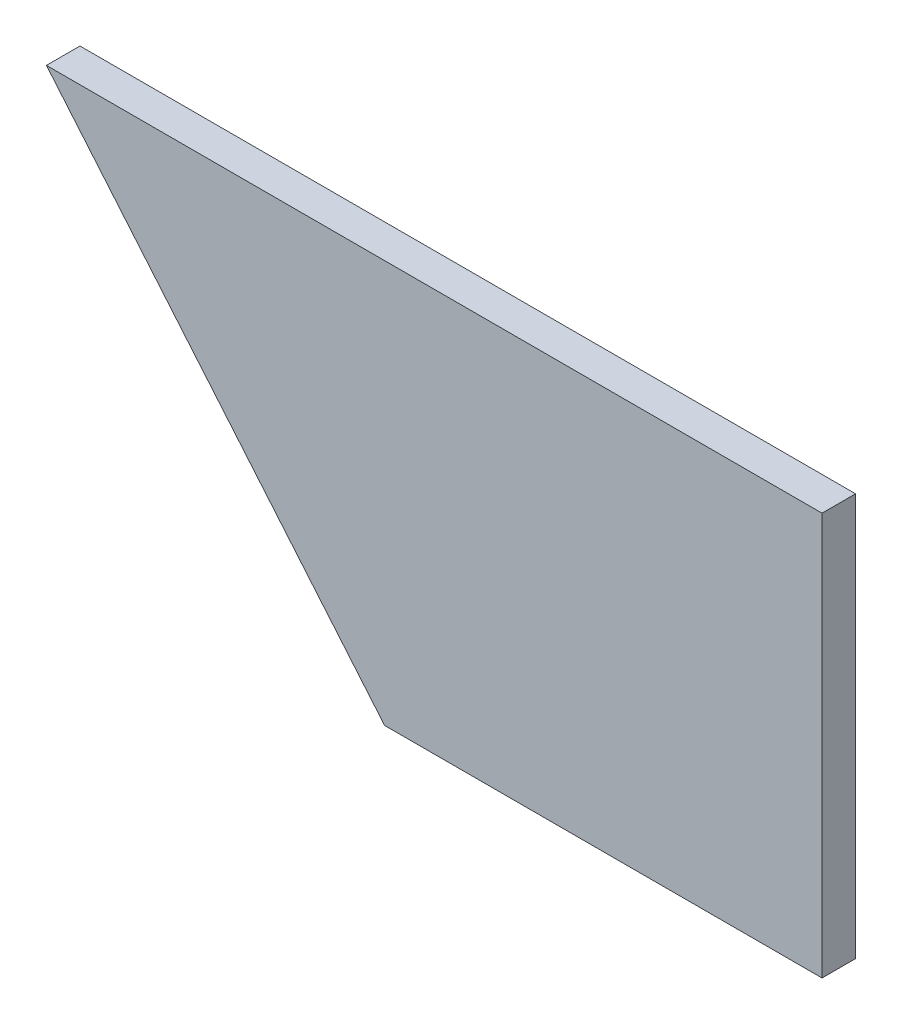
ISO-10303-21;
HEADER;
FILE_DESCRIPTION(('STEP AP214'),'2;1');
FILE_NAME('part.step','',(''),(''),'','','');
FILE_SCHEMA(('AUTOMOTIVE_DESIGN { 1 0 10303 214 1 1 1 1 }'));
ENDSEC;
DATA;
#1=APPLICATION_CONTEXT('core data for automotive mechanical design processes');
#2=APPLICATION_PROTOCOL_DEFINITION('international standard','automotive_design',2000,#1);
#3=PRODUCT_CONTEXT('',#1,'mechanical');
#4=PRODUCT('Part','Part','',(#3));
#5=PRODUCT_RELATED_PRODUCT_CATEGORY('part','',(#4));
#6=PRODUCT_DEFINITION_FORMATION('','',#4);
#7=PRODUCT_DEFINITION_CONTEXT('part definition',#1,'design');
#8=PRODUCT_DEFINITION('design','',#6,#7);
#9=PRODUCT_DEFINITION_SHAPE('','',#8);
#10=(LENGTH_UNIT() NAMED_UNIT(*) SI_UNIT(.MILLI.,.METRE.));
#11=(NAMED_UNIT(*) PLANE_ANGLE_UNIT() SI_UNIT($,.RADIAN.));
#12=(NAMED_UNIT(*) SI_UNIT($,.STERADIAN.) SOLID_ANGLE_UNIT());
#13=UNCERTAINTY_MEASURE_WITH_UNIT(LENGTH_MEASURE(1.E-05),#10,'distance_accuracy_value','');
#14=(GEOMETRIC_REPRESENTATION_CONTEXT(3) GLOBAL_UNCERTAINTY_ASSIGNED_CONTEXT((#13)) GLOBAL_UNIT_ASSIGNED_CONTEXT((#10,
#11,#12)) REPRESENTATION_CONTEXT('',''));
#15=CARTESIAN_POINT('',(0.,0.,0.));
#16=DIRECTION('',(0.,0.,1.));
#17=DIRECTION('',(1.,0.,0.));
#18=AXIS2_PLACEMENT_3D('',#15,#16,#17);
#19=CARTESIAN_POINT('',(12.827,0.,3.175));
#20=DIRECTION('',(0.765704864789611,0.643192086423273,0.));
#21=DIRECTION('',(-0.643192086423273,0.765704864789611,0.));
#22=AXIS2_PLACEMENT_3D('',#19,#20,#21);
#23=PLANE('',#22);
#24=DIRECTION('',(0.643192086423273,-0.765704864789611,0.));
#25=VECTOR('',#24,1.);
#26=CARTESIAN_POINT('',(12.827,0.,0.));
#27=LINE('',#26,#25);
#28=CARTESIAN_POINT('',(-19.177,38.1,0.));
#29=VERTEX_POINT('',#28);
#30=CARTESIAN_POINT('',(12.827,0.,0.));
#31=VERTEX_POINT('',#30);
#32=EDGE_CURVE('E112',#29,#31,#27,.T.);
#33=ORIENTED_EDGE('',*,*,#32,.T.);
#34=DIRECTION('',(0.,0.,-1.));
#35=VECTOR('',#34,1.);
#36=CARTESIAN_POINT('',(12.827,0.,3.175));
#37=LINE('',#36,#35);
#38=CARTESIAN_POINT('',(12.827,0.,3.175));
#39=VERTEX_POINT('',#38);
#40=EDGE_CURVE('E11',#39,#31,#37,.T.);
#41=ORIENTED_EDGE('',*,*,#40,.F.);
#42=DIRECTION('',(0.643192086423273,-0.765704864789611,0.));
#43=VECTOR('',#42,1.);
#44=CARTESIAN_POINT('',(12.827,0.,3.175));
#45=LINE('',#44,#43);
#46=CARTESIAN_POINT('',(-19.177,38.1,3.175));
#47=VERTEX_POINT('',#46);
#48=EDGE_CURVE('E96',#47,#39,#45,.T.);
#49=ORIENTED_EDGE('',*,*,#48,.F.);
#50=DIRECTION('',(0.,0.,-1.));
#51=VECTOR('',#50,1.);
#52=CARTESIAN_POINT('',(-19.177,38.1,3.175));
#53=LINE('',#52,#51);
#54=EDGE_CURVE('E108',#47,#29,#53,.T.);
#55=ORIENTED_EDGE('',*,*,#54,.T.);
#56=EDGE_LOOP('',(#33,#41,#49,#55));
#57=FACE_BOUND('',#56,.T.);
#58=ADVANCED_FACE('F38',(#57),#23,.F.);
#59=CARTESIAN_POINT('',(12.827,0.,3.175));
#60=DIRECTION('',(0.,1.,0.));
#61=DIRECTION('',(0.,0.,1.));
#62=AXIS2_PLACEMENT_3D('',#59,#60,#61);
#63=PLANE('',#62);
#64=DIRECTION('',(1.,0.,0.));
#65=VECTOR('',#64,1.);
#66=CARTESIAN_POINT('',(12.827,0.,0.));
#67=LINE('',#66,#65);
#68=CARTESIAN_POINT('',(54.229,0.,0.));
#69=VERTEX_POINT('',#68);
#70=EDGE_CURVE('E101',#31,#69,#67,.T.);
#71=ORIENTED_EDGE('',*,*,#70,.T.);
#72=DIRECTION('',(0.,0.,-1.));
#73=VECTOR('',#72,1.);
#74=CARTESIAN_POINT('',(54.229,0.,3.175));
#75=LINE('',#74,#73);
#76=CARTESIAN_POINT('',(54.229,0.,3.175));
#77=VERTEX_POINT('',#76);
#78=EDGE_CURVE('E47',#77,#69,#75,.T.);
#79=ORIENTED_EDGE('',*,*,#78,.F.);
#80=DIRECTION('',(1.,0.,0.));
#81=VECTOR('',#80,1.);
#82=CARTESIAN_POINT('',(12.827,0.,3.175));
#83=LINE('',#82,#81);
#84=EDGE_CURVE('E91',#39,#77,#83,.T.);
#85=ORIENTED_EDGE('',*,*,#84,.F.);
#86=ORIENTED_EDGE('',*,*,#40,.T.);
#87=EDGE_LOOP('',(#71,#79,#85,#86));
#88=FACE_BOUND('',#87,.T.);
#89=ADVANCED_FACE('F100',(#88),#63,.F.);
#90=CARTESIAN_POINT('',(54.229,38.1,3.175));
#91=DIRECTION('',(-1.,0.,0.));
#92=DIRECTION('',(0.,-1.,0.));
#93=AXIS2_PLACEMENT_3D('',#90,#91,#92);
#94=PLANE('',#93);
#95=DIRECTION('',(0.,1.,0.));
#96=VECTOR('',#95,1.);
#97=CARTESIAN_POINT('',(54.229,38.1,0.));
#98=LINE('',#97,#96);
#99=CARTESIAN_POINT('',(54.229,38.1,0.));
#100=VERTEX_POINT('',#99);
#101=EDGE_CURVE('E77',#69,#100,#98,.T.);
#102=ORIENTED_EDGE('',*,*,#101,.T.);
#103=DIRECTION('',(0.,0.,-1.));
#104=VECTOR('',#103,1.);
#105=CARTESIAN_POINT('',(54.229,38.1,3.175));
#106=LINE('',#105,#104);
#107=CARTESIAN_POINT('',(54.229,38.1,3.175));
#108=VERTEX_POINT('',#107);
#109=EDGE_CURVE('E103',#108,#100,#106,.T.);
#110=ORIENTED_EDGE('',*,*,#109,.F.);
#111=DIRECTION('',(0.,1.,0.));
#112=VECTOR('',#111,1.);
#113=CARTESIAN_POINT('',(54.229,38.1,3.175));
#114=LINE('',#113,#112);
#115=EDGE_CURVE('E94',#77,#108,#114,.T.);
#116=ORIENTED_EDGE('',*,*,#115,.F.);
#117=ORIENTED_EDGE('',*,*,#78,.T.);
#118=EDGE_LOOP('',(#102,#110,#116,#117));
#119=FACE_BOUND('',#118,.T.);
#120=ADVANCED_FACE('F104',(#119),#94,.F.);
#121=CARTESIAN_POINT('',(-19.177,38.1,3.175));
#122=DIRECTION('',(0.,-1.,0.));
#123=DIRECTION('',(1.,0.,0.));
#124=AXIS2_PLACEMENT_3D('',#121,#122,#123);
#125=PLANE('',#124);
#126=DIRECTION('',(-1.,0.,0.));
#127=VECTOR('',#126,1.);
#128=CARTESIAN_POINT('',(-19.177,38.1,0.));
#129=LINE('',#128,#127);
#130=EDGE_CURVE('E83',#100,#29,#129,.T.);
#131=ORIENTED_EDGE('',*,*,#130,.T.);
#132=ORIENTED_EDGE('',*,*,#54,.F.);
#133=DIRECTION('',(-1.,0.,0.));
#134=VECTOR('',#133,1.);
#135=CARTESIAN_POINT('',(-19.177,38.1,3.175));
#136=LINE('',#135,#134);
#137=EDGE_CURVE('E55',#108,#47,#136,.T.);
#138=ORIENTED_EDGE('',*,*,#137,.F.);
#139=ORIENTED_EDGE('',*,*,#109,.T.);
#140=EDGE_LOOP('',(#131,#132,#138,#139));
#141=FACE_BOUND('',#140,.T.);
#142=ADVANCED_FACE('F124',(#141),#125,.F.);
#143=CARTESIAN_POINT('',(0.,0.,3.175));
#144=DIRECTION('',(0.,0.,-1.));
#145=DIRECTION('',(-1.,0.,0.));
#146=AXIS2_PLACEMENT_3D('',#143,#144,#145);
#147=PLANE('',#146);
#148=ORIENTED_EDGE('',*,*,#48,.T.);
#149=ORIENTED_EDGE('',*,*,#84,.T.);
#150=ORIENTED_EDGE('',*,*,#115,.T.);
#151=ORIENTED_EDGE('',*,*,#137,.T.);
#152=EDGE_LOOP('',(#148,#149,#150,#151));
#153=FACE_BOUND('',#152,.T.);
#154=ADVANCED_FACE('F92',(#153),#147,.F.);
#155=CARTESIAN_POINT('',(0.,0.,0.));
#156=DIRECTION('',(0.,0.,-1.));
#157=DIRECTION('',(-1.,0.,0.));
#158=AXIS2_PLACEMENT_3D('',#155,#156,#157);
#159=PLANE('',#158);
#160=ORIENTED_EDGE('',*,*,#32,.F.);
#161=ORIENTED_EDGE('',*,*,#130,.F.);
#162=ORIENTED_EDGE('',*,*,#101,.F.);
#163=ORIENTED_EDGE('',*,*,#70,.F.);
#164=EDGE_LOOP('',(#160,#161,#162,#163));
#165=FACE_BOUND('',#164,.T.);
#166=ADVANCED_FACE('F127',(#165),#159,.T.);
#167=CLOSED_SHELL('',(#58,#89,#120,#142,#154,#166));
#168=MANIFOLD_SOLID_BREP('B2',#167);
#169=ADVANCED_BREP_SHAPE_REPRESENTATION('',(#18,#168),#14);
#170=SHAPE_DEFINITION_REPRESENTATION(#9,#169);
ENDSEC;
END-ISO-10303-21;
